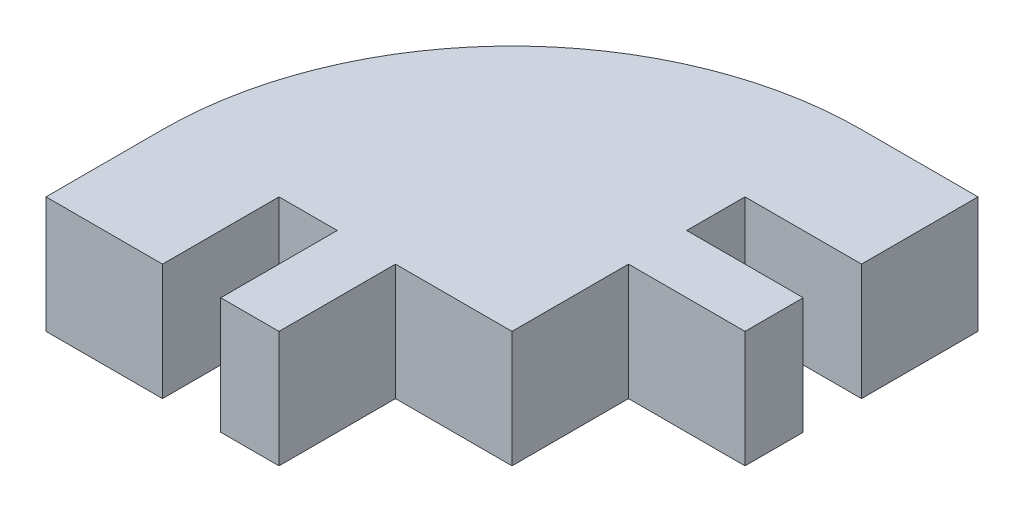
ISO-10303-21;
HEADER;
FILE_DESCRIPTION(('STEP AP214'),'2;1');
FILE_NAME('part.step','',(''),(''),'','','');
FILE_SCHEMA(('AUTOMOTIVE_DESIGN { 1 0 10303 214 1 1 1 1 }'));
ENDSEC;
DATA;
#1=APPLICATION_CONTEXT('core data for automotive mechanical design processes');
#2=APPLICATION_PROTOCOL_DEFINITION('international standard','automotive_design',2000,#1);
#3=PRODUCT_CONTEXT('',#1,'mechanical');
#4=PRODUCT('Part','Part','',(#3));
#5=PRODUCT_RELATED_PRODUCT_CATEGORY('part','',(#4));
#6=PRODUCT_DEFINITION_FORMATION('','',#4);
#7=PRODUCT_DEFINITION_CONTEXT('part definition',#1,'design');
#8=PRODUCT_DEFINITION('design','',#6,#7);
#9=PRODUCT_DEFINITION_SHAPE('','',#8);
#10=(LENGTH_UNIT() NAMED_UNIT(*) SI_UNIT(.MILLI.,.METRE.));
#11=(NAMED_UNIT(*) PLANE_ANGLE_UNIT() SI_UNIT($,.RADIAN.));
#12=(NAMED_UNIT(*) SI_UNIT($,.STERADIAN.) SOLID_ANGLE_UNIT());
#13=UNCERTAINTY_MEASURE_WITH_UNIT(LENGTH_MEASURE(1.E-05),#10,'distance_accuracy_value','');
#14=(GEOMETRIC_REPRESENTATION_CONTEXT(3) GLOBAL_UNCERTAINTY_ASSIGNED_CONTEXT((#13)) GLOBAL_UNIT_ASSIGNED_CONTEXT((#10,
#11,#12)) REPRESENTATION_CONTEXT('',''));
#15=CARTESIAN_POINT('',(0.,0.,0.));
#16=DIRECTION('',(0.,0.,1.));
#17=DIRECTION('',(1.,0.,0.));
#18=AXIS2_PLACEMENT_3D('',#15,#16,#17);
#19=CARTESIAN_POINT('',(-125.,0.,9.));
#20=DIRECTION('',(0.,0.,1.));
#21=DIRECTION('',(1.,0.,0.));
#22=AXIS2_PLACEMENT_3D('',#19,#20,#21);
#23=PLANE('',#22);
#24=DIRECTION('',(1.,0.,0.));
#25=VECTOR('',#24,1.);
#26=CARTESIAN_POINT('',(0.,-20.5,9.));
#27=LINE('',#26,#25);
#28=CARTESIAN_POINT('',(-6.49999999999998,-20.5,9.));
#29=VERTEX_POINT('',#28);
#30=CARTESIAN_POINT('',(2.50000000000001,-20.5,9.));
#31=VERTEX_POINT('',#30);
#32=EDGE_CURVE('E276',#29,#31,#27,.T.);
#33=ORIENTED_EDGE('',*,*,#32,.F.);
#34=DIRECTION('',(0.,-1.,0.));
#35=VECTOR('',#34,1.);
#36=CARTESIAN_POINT('',(-6.49999999999998,25.,9.));
#37=LINE('',#36,#35);
#38=CARTESIAN_POINT('',(-6.49999999999998,-29.5,9.));
#39=VERTEX_POINT('',#38);
#40=EDGE_CURVE('E217',#29,#39,#37,.T.);
#41=ORIENTED_EDGE('',*,*,#40,.T.);
#42=DIRECTION('',(1.,0.,0.));
#43=VECTOR('',#42,1.);
#44=CARTESIAN_POINT('',(0.,-29.5,9.));
#45=LINE('',#44,#43);
#46=CARTESIAN_POINT('',(2.50000000000001,-29.5,9.));
#47=VERTEX_POINT('',#46);
#48=EDGE_CURVE('E200',#39,#47,#45,.T.);
#49=ORIENTED_EDGE('',*,*,#48,.T.);
#50=DIRECTION('',(0.,-1.,0.));
#51=VECTOR('',#50,1.);
#52=CARTESIAN_POINT('',(2.50000000000001,25.,9.));
#53=LINE('',#52,#51);
#54=EDGE_CURVE('E215',#31,#47,#53,.T.);
#55=ORIENTED_EDGE('',*,*,#54,.F.);
#56=EDGE_LOOP('',(#33,#41,#49,#55));
#57=FACE_BOUND('',#56,.T.);
#58=ADVANCED_FACE('F82',(#57),#23,.T.);
#59=CARTESIAN_POINT('',(7.00000000000001,-20.5,9.));
#60=VERTEX_POINT('',#59);
#61=CARTESIAN_POINT('',(11.5,-20.5,9.));
#62=VERTEX_POINT('',#61);
#63=EDGE_CURVE('E274',#60,#62,#27,.T.);
#64=ORIENTED_EDGE('',*,*,#63,.F.);
#65=DIRECTION('',(0.,-1.,0.));
#66=VECTOR('',#65,1.);
#67=CARTESIAN_POINT('',(7.00000000000001,25.,9.));
#68=LINE('',#67,#66);
#69=CARTESIAN_POINT('',(7.00000000000001,-29.5,9.));
#70=VERTEX_POINT('',#69);
#71=EDGE_CURVE('E224',#60,#70,#68,.T.);
#72=ORIENTED_EDGE('',*,*,#71,.T.);
#73=CARTESIAN_POINT('',(11.5,-29.5,9.));
#74=VERTEX_POINT('',#73);
#75=EDGE_CURVE('E218',#70,#74,#45,.T.);
#76=ORIENTED_EDGE('',*,*,#75,.T.);
#77=DIRECTION('',(0.,-1.,0.));
#78=VECTOR('',#77,1.);
#79=CARTESIAN_POINT('',(11.5,25.,9.));
#80=LINE('',#79,#78);
#81=EDGE_CURVE('E325',#62,#74,#80,.T.);
#82=ORIENTED_EDGE('',*,*,#81,.F.);
#83=EDGE_LOOP('',(#64,#72,#76,#82));
#84=FACE_BOUND('',#83,.T.);
#85=ADVANCED_FACE('F388',(#84),#23,.T.);
#86=CARTESIAN_POINT('',(29.5,0.,9.));
#87=DIRECTION('',(1.,0.,0.));
#88=DIRECTION('',(0.,0.,-1.));
#89=AXIS2_PLACEMENT_3D('',#86,#87,#88);
#90=PLANE('',#89);
#91=DIRECTION('',(0.,0.,-1.));
#92=VECTOR('',#91,1.);
#93=CARTESIAN_POINT('',(29.5,-20.5,9.));
#94=LINE('',#93,#92);
#95=CARTESIAN_POINT('',(29.5,-20.5,-9.));
#96=VERTEX_POINT('',#95);
#97=CARTESIAN_POINT('',(29.5,-20.5,-13.5));
#98=VERTEX_POINT('',#97);
#99=EDGE_CURVE('E298',#96,#98,#94,.T.);
#100=ORIENTED_EDGE('',*,*,#99,.F.);
#101=DIRECTION('',(0.,-1.,0.));
#102=VECTOR('',#101,1.);
#103=CARTESIAN_POINT('',(29.5,25.,-9.));
#104=LINE('',#103,#102);
#105=CARTESIAN_POINT('',(29.5,-29.5,-9.));
#106=VERTEX_POINT('',#105);
#107=EDGE_CURVE('E308',#96,#106,#104,.T.);
#108=ORIENTED_EDGE('',*,*,#107,.T.);
#109=DIRECTION('',(0.,0.,-1.));
#110=VECTOR('',#109,1.);
#111=CARTESIAN_POINT('',(29.5,-29.5,9.));
#112=LINE('',#111,#110);
#113=CARTESIAN_POINT('',(29.5,-29.5,-13.5));
#114=VERTEX_POINT('',#113);
#115=EDGE_CURVE('E96',#106,#114,#112,.T.);
#116=ORIENTED_EDGE('',*,*,#115,.T.);
#117=DIRECTION('',(0.,-1.,0.));
#118=VECTOR('',#117,1.);
#119=CARTESIAN_POINT('',(29.5,25.,-13.5));
#120=LINE('',#119,#118);
#121=EDGE_CURVE('E311',#98,#114,#120,.T.);
#122=ORIENTED_EDGE('',*,*,#121,.F.);
#123=EDGE_LOOP('',(#100,#108,#116,#122));
#124=FACE_BOUND('',#123,.T.);
#125=ADVANCED_FACE('F369',(#124),#90,.T.);
#126=CARTESIAN_POINT('',(0.,0.,-27.));
#127=DIRECTION('',(0.,0.,-1.));
#128=DIRECTION('',(-1.,0.,0.));
#129=AXIS2_PLACEMENT_3D('',#126,#127,#128);
#130=PLANE('',#129);
#131=DIRECTION('',(1.,0.,0.));
#132=VECTOR('',#131,1.);
#133=CARTESIAN_POINT('',(0.,-20.5,-27.));
#134=LINE('',#133,#132);
#135=CARTESIAN_POINT('',(20.5,-20.5,-27.));
#136=VERTEX_POINT('',#135);
#137=CARTESIAN_POINT('',(29.5,-20.5,-27.));
#138=VERTEX_POINT('',#137);
#139=EDGE_CURVE('E209',#136,#138,#134,.T.);
#140=ORIENTED_EDGE('',*,*,#139,.T.);
#141=DIRECTION('',(0.,-1.,0.));
#142=VECTOR('',#141,1.);
#143=CARTESIAN_POINT('',(29.5,25.,-27.));
#144=LINE('',#143,#142);
#145=CARTESIAN_POINT('',(29.5,-29.5,-27.));
#146=VERTEX_POINT('',#145);
#147=EDGE_CURVE('E273',#138,#146,#144,.T.);
#148=ORIENTED_EDGE('',*,*,#147,.T.);
#149=DIRECTION('',(1.,0.,0.));
#150=VECTOR('',#149,1.);
#151=CARTESIAN_POINT('',(0.,-29.5,-27.));
#152=LINE('',#151,#150);
#153=CARTESIAN_POINT('',(20.5,-29.5,-27.));
#154=VERTEX_POINT('',#153);
#155=EDGE_CURVE('E103',#154,#146,#152,.T.);
#156=ORIENTED_EDGE('',*,*,#155,.F.);
#157=DIRECTION('',(0.,1.,0.));
#158=VECTOR('',#157,1.);
#159=CARTESIAN_POINT('',(20.5,-29.5,-27.));
#160=LINE('',#159,#158);
#161=EDGE_CURVE('E256',#154,#136,#160,.T.);
#162=ORIENTED_EDGE('',*,*,#161,.T.);
#163=EDGE_LOOP('',(#140,#148,#156,#162));
#164=FACE_BOUND('',#163,.T.);
#165=ADVANCED_FACE('F270',(#164),#130,.T.);
#166=CARTESIAN_POINT('',(0.,0.,-18.));
#167=DIRECTION('',(0.,0.,-1.));
#168=DIRECTION('',(-1.,0.,0.));
#169=AXIS2_PLACEMENT_3D('',#166,#167,#168);
#170=PLANE('',#169);
#171=DIRECTION('',(0.,-1.,0.));
#172=VECTOR('',#171,1.);
#173=CARTESIAN_POINT('',(29.5,25.,-18.));
#174=LINE('',#173,#172);
#175=CARTESIAN_POINT('',(29.5,-20.5,-18.));
#176=VERTEX_POINT('',#175);
#177=CARTESIAN_POINT('',(29.5,-29.5,-18.));
#178=VERTEX_POINT('',#177);
#179=EDGE_CURVE('E320',#176,#178,#174,.T.);
#180=ORIENTED_EDGE('',*,*,#179,.F.);
#181=DIRECTION('',(-1.,0.,0.));
#182=VECTOR('',#181,1.);
#183=CARTESIAN_POINT('',(0.,-20.5,-18.));
#184=LINE('',#183,#182);
#185=CARTESIAN_POINT('',(20.5,-20.5,-18.));
#186=VERTEX_POINT('',#185);
#187=EDGE_CURVE('E304',#176,#186,#184,.T.);
#188=ORIENTED_EDGE('',*,*,#187,.T.);
#189=DIRECTION('',(0.,-1.,0.));
#190=VECTOR('',#189,1.);
#191=CARTESIAN_POINT('',(20.5,25.,-18.));
#192=LINE('',#191,#190);
#193=CARTESIAN_POINT('',(20.5,-29.5,-18.));
#194=VERTEX_POINT('',#193);
#195=EDGE_CURVE('E317',#186,#194,#192,.T.);
#196=ORIENTED_EDGE('',*,*,#195,.T.);
#197=DIRECTION('',(-1.,0.,0.));
#198=VECTOR('',#197,1.);
#199=CARTESIAN_POINT('',(0.,-29.5,-18.));
#200=LINE('',#199,#198);
#201=EDGE_CURVE('E288',#178,#194,#200,.T.);
#202=ORIENTED_EDGE('',*,*,#201,.F.);
#203=EDGE_LOOP('',(#180,#188,#196,#202));
#204=FACE_BOUND('',#203,.T.);
#205=ADVANCED_FACE('F357',(#204),#170,.F.);
#206=CARTESIAN_POINT('',(2.50000000000001,25.,0.));
#207=DIRECTION('',(1.,0.,0.));
#208=DIRECTION('',(0.,0.,-1.));
#209=AXIS2_PLACEMENT_3D('',#206,#207,#208);
#210=PLANE('',#209);
#211=DIRECTION('',(0.,0.,-1.));
#212=VECTOR('',#211,1.);
#213=CARTESIAN_POINT('',(2.50000000000001,-20.5,0.));
#214=LINE('',#213,#212);
#215=CARTESIAN_POINT('',(2.5,-20.5,0.));
#216=VERTEX_POINT('',#215);
#217=EDGE_CURVE('E222',#31,#216,#214,.T.);
#218=ORIENTED_EDGE('',*,*,#217,.F.);
#219=ORIENTED_EDGE('',*,*,#54,.T.);
#220=DIRECTION('',(0.,0.,-1.));
#221=VECTOR('',#220,1.);
#222=CARTESIAN_POINT('',(2.50000000000001,-29.5,0.));
#223=LINE('',#222,#221);
#224=CARTESIAN_POINT('',(2.5,-29.5,0.));
#225=VERTEX_POINT('',#224);
#226=EDGE_CURVE('E196',#47,#225,#223,.T.);
#227=ORIENTED_EDGE('',*,*,#226,.T.);
#228=DIRECTION('',(0.,-1.,0.));
#229=VECTOR('',#228,1.);
#230=CARTESIAN_POINT('',(2.50000000000001,25.,0.));
#231=LINE('',#230,#229);
#232=EDGE_CURVE('E337',#216,#225,#231,.T.);
#233=ORIENTED_EDGE('',*,*,#232,.F.);
#234=EDGE_LOOP('',(#218,#219,#227,#233));
#235=FACE_BOUND('',#234,.T.);
#236=ADVANCED_FACE('F221',(#235),#210,.T.);
#237=CARTESIAN_POINT('',(7.00000000000001,25.,0.));
#238=DIRECTION('',(-1.,0.,0.));
#239=DIRECTION('',(0.,0.,1.));
#240=AXIS2_PLACEMENT_3D('',#237,#238,#239);
#241=PLANE('',#240);
#242=DIRECTION('',(0.,0.,1.));
#243=VECTOR('',#242,1.);
#244=CARTESIAN_POINT('',(7.00000000000001,-20.5,0.));
#245=LINE('',#244,#243);
#246=CARTESIAN_POINT('',(7.00000000000001,-20.5,0.));
#247=VERTEX_POINT('',#246);
#248=EDGE_CURVE('E306',#247,#60,#245,.T.);
#249=ORIENTED_EDGE('',*,*,#248,.F.);
#250=DIRECTION('',(0.,-1.,0.));
#251=VECTOR('',#250,1.);
#252=CARTESIAN_POINT('',(7.00000000000001,25.,0.));
#253=LINE('',#252,#251);
#254=CARTESIAN_POINT('',(7.00000000000001,-29.5,0.));
#255=VERTEX_POINT('',#254);
#256=EDGE_CURVE('E229',#247,#255,#253,.T.);
#257=ORIENTED_EDGE('',*,*,#256,.T.);
#258=DIRECTION('',(0.,0.,1.));
#259=VECTOR('',#258,1.);
#260=CARTESIAN_POINT('',(7.00000000000001,-29.5,0.));
#261=LINE('',#260,#259);
#262=EDGE_CURVE('E290',#255,#70,#261,.T.);
#263=ORIENTED_EDGE('',*,*,#262,.T.);
#264=ORIENTED_EDGE('',*,*,#71,.F.);
#265=EDGE_LOOP('',(#249,#257,#263,#264));
#266=FACE_BOUND('',#265,.T.);
#267=ADVANCED_FACE('F341',(#266),#241,.T.);
#268=CARTESIAN_POINT('',(0.,25.,-13.5));
#269=DIRECTION('',(0.,0.,-1.));
#270=DIRECTION('',(-1.,0.,0.));
#271=AXIS2_PLACEMENT_3D('',#268,#269,#270);
#272=PLANE('',#271);
#273=DIRECTION('',(-1.,0.,0.));
#274=VECTOR('',#273,1.);
#275=CARTESIAN_POINT('',(0.,-20.5,-13.5));
#276=LINE('',#275,#274);
#277=CARTESIAN_POINT('',(20.5,-20.5,-13.5));
#278=VERTEX_POINT('',#277);
#279=EDGE_CURVE('E296',#98,#278,#276,.T.);
#280=ORIENTED_EDGE('',*,*,#279,.F.);
#281=ORIENTED_EDGE('',*,*,#121,.T.);
#282=DIRECTION('',(-1.,0.,0.));
#283=VECTOR('',#282,1.);
#284=CARTESIAN_POINT('',(0.,-29.5,-13.5));
#285=LINE('',#284,#283);
#286=CARTESIAN_POINT('',(20.5,-29.5,-13.5000000000218));
#287=VERTEX_POINT('',#286);
#288=EDGE_CURVE('E281',#114,#287,#285,.T.);
#289=ORIENTED_EDGE('',*,*,#288,.T.);
#290=DIRECTION('',(0.,-1.,0.));
#291=VECTOR('',#290,1.);
#292=CARTESIAN_POINT('',(20.5,25.,-13.5));
#293=LINE('',#292,#291);
#294=EDGE_CURVE('E314',#278,#287,#293,.T.);
#295=ORIENTED_EDGE('',*,*,#294,.F.);
#296=EDGE_LOOP('',(#280,#281,#289,#295));
#297=FACE_BOUND('',#296,.T.);
#298=ADVANCED_FACE('F365',(#297),#272,.T.);
#299=CARTESIAN_POINT('',(0.,25.,-9.));
#300=DIRECTION('',(0.,0.,1.));
#301=DIRECTION('',(1.,0.,0.));
#302=AXIS2_PLACEMENT_3D('',#299,#300,#301);
#303=PLANE('',#302);
#304=DIRECTION('',(1.,0.,0.));
#305=VECTOR('',#304,1.);
#306=CARTESIAN_POINT('',(0.,-20.5,-9.));
#307=LINE('',#306,#305);
#308=CARTESIAN_POINT('',(20.5,-20.5,-9.));
#309=VERTEX_POINT('',#308);
#310=EDGE_CURVE('E300',#309,#96,#307,.T.);
#311=ORIENTED_EDGE('',*,*,#310,.F.);
#312=DIRECTION('',(0.,-1.,0.));
#313=VECTOR('',#312,1.);
#314=CARTESIAN_POINT('',(20.5,25.,-9.));
#315=LINE('',#314,#313);
#316=CARTESIAN_POINT('',(20.5,-29.5,-9.));
#317=VERTEX_POINT('',#316);
#318=EDGE_CURVE('E334',#309,#317,#315,.T.);
#319=ORIENTED_EDGE('',*,*,#318,.T.);
#320=DIRECTION('',(1.,0.,0.));
#321=VECTOR('',#320,1.);
#322=CARTESIAN_POINT('',(0.,-29.5,-9.));
#323=LINE('',#322,#321);
#324=EDGE_CURVE('E284',#317,#106,#323,.T.);
#325=ORIENTED_EDGE('',*,*,#324,.T.);
#326=ORIENTED_EDGE('',*,*,#107,.F.);
#327=EDGE_LOOP('',(#311,#319,#325,#326));
#328=FACE_BOUND('',#327,.T.);
#329=ADVANCED_FACE('F372',(#328),#303,.T.);
#330=CARTESIAN_POINT('',(29.5,25.,0.));
#331=DIRECTION('',(1.,0.,0.));
#332=DIRECTION('',(0.,0.,-1.));
#333=AXIS2_PLACEMENT_3D('',#330,#331,#332);
#334=PLANE('',#333);
#335=DIRECTION('',(0.,0.,-1.));
#336=VECTOR('',#335,1.);
#337=CARTESIAN_POINT('',(29.5,-20.5,0.));
#338=LINE('',#337,#336);
#339=EDGE_CURVE('E302',#176,#138,#338,.T.);
#340=ORIENTED_EDGE('',*,*,#339,.F.);
#341=ORIENTED_EDGE('',*,*,#179,.T.);
#342=DIRECTION('',(0.,0.,-1.));
#343=VECTOR('',#342,1.);
#344=CARTESIAN_POINT('',(29.5,-29.5,0.));
#345=LINE('',#344,#343);
#346=EDGE_CURVE('E286',#178,#146,#345,.T.);
#347=ORIENTED_EDGE('',*,*,#346,.T.);
#348=ORIENTED_EDGE('',*,*,#147,.F.);
#349=EDGE_LOOP('',(#340,#341,#347,#348));
#350=FACE_BOUND('',#349,.T.);
#351=ADVANCED_FACE('F354',(#350),#334,.T.);
#352=CARTESIAN_POINT('',(11.5,25.,0.));
#353=DIRECTION('',(1.,0.,0.));
#354=DIRECTION('',(0.,0.,-1.));
#355=AXIS2_PLACEMENT_3D('',#352,#353,#354);
#356=PLANE('',#355);
#357=DIRECTION('',(0.,0.,-1.));
#358=VECTOR('',#357,1.);
#359=CARTESIAN_POINT('',(11.5,-20.5,0.));
#360=LINE('',#359,#358);
#361=CARTESIAN_POINT('',(11.5,-20.5,0.));
#362=VERTEX_POINT('',#361);
#363=EDGE_CURVE('E294',#62,#362,#360,.T.);
#364=ORIENTED_EDGE('',*,*,#363,.F.);
#365=ORIENTED_EDGE('',*,*,#81,.T.);
#366=DIRECTION('',(0.,0.,-1.));
#367=VECTOR('',#366,1.);
#368=CARTESIAN_POINT('',(11.5,-29.5,0.));
#369=LINE('',#368,#367);
#370=CARTESIAN_POINT('',(11.5,-29.5,0.));
#371=VERTEX_POINT('',#370);
#372=EDGE_CURVE('E208',#74,#371,#369,.T.);
#373=ORIENTED_EDGE('',*,*,#372,.T.);
#374=DIRECTION('',(0.,-1.,0.));
#375=VECTOR('',#374,1.);
#376=CARTESIAN_POINT('',(11.5,25.,0.));
#377=LINE('',#376,#375);
#378=EDGE_CURVE('E328',#362,#371,#377,.T.);
#379=ORIENTED_EDGE('',*,*,#378,.F.);
#380=EDGE_LOOP('',(#364,#365,#373,#379));
#381=FACE_BOUND('',#380,.T.);
#382=ADVANCED_FACE('F385',(#381),#356,.T.);
#383=CARTESIAN_POINT('',(-6.49999999999998,25.,0.));
#384=DIRECTION('',(-1.,0.,0.));
#385=DIRECTION('',(0.,0.,1.));
#386=AXIS2_PLACEMENT_3D('',#383,#384,#385);
#387=PLANE('',#386);
#388=DIRECTION('',(0.,0.,1.));
#389=VECTOR('',#388,1.);
#390=CARTESIAN_POINT('',(-6.49999999999998,-20.5,0.));
#391=LINE('',#390,#389);
#392=CARTESIAN_POINT('',(-6.49999999999998,-20.5,0.));
#393=VERTEX_POINT('',#392);
#394=EDGE_CURVE('E12',#393,#29,#391,.T.);
#395=ORIENTED_EDGE('',*,*,#394,.F.);
#396=DIRECTION('',(0.,1.,0.));
#397=VECTOR('',#396,1.);
#398=CARTESIAN_POINT('',(-6.49999999999998,-29.5,0.));
#399=LINE('',#398,#397);
#400=CARTESIAN_POINT('',(-6.49999999999998,-29.5,0.));
#401=VERTEX_POINT('',#400);
#402=EDGE_CURVE('E257',#401,#393,#399,.T.);
#403=ORIENTED_EDGE('',*,*,#402,.F.);
#404=DIRECTION('',(0.,0.,1.));
#405=VECTOR('',#404,1.);
#406=CARTESIAN_POINT('',(-6.49999999999998,-29.5,0.));
#407=LINE('',#406,#405);
#408=EDGE_CURVE('E89',#401,#39,#407,.T.);
#409=ORIENTED_EDGE('',*,*,#408,.T.);
#410=ORIENTED_EDGE('',*,*,#40,.F.);
#411=EDGE_LOOP('',(#395,#403,#409,#410));
#412=FACE_BOUND('',#411,.T.);
#413=ADVANCED_FACE('F263',(#412),#387,.T.);
#414=CARTESIAN_POINT('',(0.,-29.5,0.));
#415=DIRECTION('',(0.,1.,0.));
#416=DIRECTION('',(0.,0.,1.));
#417=AXIS2_PLACEMENT_3D('',#414,#415,#416);
#418=PLANE('',#417);
#419=DIRECTION('',(-1.,0.,0.));
#420=VECTOR('',#419,1.);
#421=CARTESIAN_POINT('',(0.,-29.5,0.));
#422=LINE('',#421,#420);
#423=CARTESIAN_POINT('',(20.5,-29.5,0.));
#424=VERTEX_POINT('',#423);
#425=EDGE_CURVE('E251',#424,#371,#422,.T.);
#426=ORIENTED_EDGE('',*,*,#425,.T.);
#427=ORIENTED_EDGE('',*,*,#372,.F.);
#428=ORIENTED_EDGE('',*,*,#75,.F.);
#429=ORIENTED_EDGE('',*,*,#262,.F.);
#430=DIRECTION('',(-1.,0.,0.));
#431=VECTOR('',#430,1.);
#432=CARTESIAN_POINT('',(0.,-29.5,0.));
#433=LINE('',#432,#431);
#434=EDGE_CURVE('E203',#255,#225,#433,.T.);
#435=ORIENTED_EDGE('',*,*,#434,.T.);
#436=ORIENTED_EDGE('',*,*,#226,.F.);
#437=ORIENTED_EDGE('',*,*,#48,.F.);
#438=ORIENTED_EDGE('',*,*,#408,.F.);
#439=CARTESIAN_POINT('',(20.5,-29.5,0.));
#440=DIRECTION('',(0.,1.,0.));
#441=DIRECTION('',(0.,0.,1.));
#442=AXIS2_PLACEMENT_3D('',#439,#440,#441);
#443=CIRCLE('',#442,27.);
#444=EDGE_CURVE('E253',#154,#401,#443,.T.);
#445=ORIENTED_EDGE('',*,*,#444,.F.);
#446=ORIENTED_EDGE('',*,*,#155,.T.);
#447=ORIENTED_EDGE('',*,*,#346,.F.);
#448=ORIENTED_EDGE('',*,*,#201,.T.);
#449=DIRECTION('',(0.,0.,1.));
#450=VECTOR('',#449,1.);
#451=CARTESIAN_POINT('',(20.5,-29.5,0.));
#452=LINE('',#451,#450);
#453=EDGE_CURVE('E237',#194,#287,#452,.T.);
#454=ORIENTED_EDGE('',*,*,#453,.T.);
#455=ORIENTED_EDGE('',*,*,#288,.F.);
#456=ORIENTED_EDGE('',*,*,#115,.F.);
#457=ORIENTED_EDGE('',*,*,#324,.F.);
#458=DIRECTION('',(0.,0.,1.));
#459=VECTOR('',#458,1.);
#460=CARTESIAN_POINT('',(20.5,-29.5,0.));
#461=LINE('',#460,#459);
#462=EDGE_CURVE('E242',#317,#424,#461,.T.);
#463=ORIENTED_EDGE('',*,*,#462,.T.);
#464=EDGE_LOOP('',(#426,#427,#428,#429,#435,#436,#437,#438,#445,#446,#447,#448,#454,#455,#456,
#457,#463));
#465=FACE_BOUND('',#464,.T.);
#466=ADVANCED_FACE('F199',(#465),#418,.F.);
#467=CARTESIAN_POINT('',(0.,-20.5,0.));
#468=DIRECTION('',(0.,1.,0.));
#469=DIRECTION('',(0.,0.,1.));
#470=AXIS2_PLACEMENT_3D('',#467,#468,#469);
#471=PLANE('',#470);
#472=DIRECTION('',(-1.,0.,0.));
#473=VECTOR('',#472,1.);
#474=CARTESIAN_POINT('',(0.,-20.5,0.));
#475=LINE('',#474,#473);
#476=CARTESIAN_POINT('',(20.5,-20.5,0.));
#477=VERTEX_POINT('',#476);
#478=EDGE_CURVE('E245',#477,#362,#475,.T.);
#479=ORIENTED_EDGE('',*,*,#478,.F.);
#480=DIRECTION('',(0.,0.,1.));
#481=VECTOR('',#480,1.);
#482=CARTESIAN_POINT('',(20.5,-20.5,0.));
#483=LINE('',#482,#481);
#484=EDGE_CURVE('E240',#309,#477,#483,.T.);
#485=ORIENTED_EDGE('',*,*,#484,.F.);
#486=ORIENTED_EDGE('',*,*,#310,.T.);
#487=ORIENTED_EDGE('',*,*,#99,.T.);
#488=ORIENTED_EDGE('',*,*,#279,.T.);
#489=DIRECTION('',(0.,0.,1.));
#490=VECTOR('',#489,1.);
#491=CARTESIAN_POINT('',(20.5,-20.5,0.));
#492=LINE('',#491,#490);
#493=EDGE_CURVE('E234',#186,#278,#492,.T.);
#494=ORIENTED_EDGE('',*,*,#493,.F.);
#495=ORIENTED_EDGE('',*,*,#187,.F.);
#496=ORIENTED_EDGE('',*,*,#339,.T.);
#497=ORIENTED_EDGE('',*,*,#139,.F.);
#498=CARTESIAN_POINT('',(20.5,-20.5,0.));
#499=DIRECTION('',(0.,1.,0.));
#500=DIRECTION('',(0.,0.,1.));
#501=AXIS2_PLACEMENT_3D('',#498,#499,#500);
#502=CIRCLE('',#501,27.);
#503=EDGE_CURVE('E248',#136,#393,#502,.T.);
#504=ORIENTED_EDGE('',*,*,#503,.T.);
#505=ORIENTED_EDGE('',*,*,#394,.T.);
#506=ORIENTED_EDGE('',*,*,#32,.T.);
#507=ORIENTED_EDGE('',*,*,#217,.T.);
#508=DIRECTION('',(-1.,0.,0.));
#509=VECTOR('',#508,1.);
#510=CARTESIAN_POINT('',(0.,-20.5,0.));
#511=LINE('',#510,#509);
#512=EDGE_CURVE('E223',#247,#216,#511,.T.);
#513=ORIENTED_EDGE('',*,*,#512,.F.);
#514=ORIENTED_EDGE('',*,*,#248,.T.);
#515=ORIENTED_EDGE('',*,*,#63,.T.);
#516=ORIENTED_EDGE('',*,*,#363,.T.);
#517=EDGE_LOOP('',(#479,#485,#486,#487,#488,#494,#495,#496,#497,#504,#505,#506,#507,#513,#514,
#515,#516));
#518=FACE_BOUND('',#517,.T.);
#519=ADVANCED_FACE('F348',(#518),#471,.T.);
#520=CARTESIAN_POINT('',(20.5,-29.5,0.));
#521=DIRECTION('',(0.,1.,0.));
#522=DIRECTION('',(0.,0.,1.));
#523=AXIS2_PLACEMENT_3D('',#520,#521,#522);
#524=CYLINDRICAL_SURFACE('',#523,27.);
#525=ORIENTED_EDGE('',*,*,#402,.T.);
#526=ORIENTED_EDGE('',*,*,#503,.F.);
#527=ORIENTED_EDGE('',*,*,#161,.F.);
#528=ORIENTED_EDGE('',*,*,#444,.T.);
#529=EDGE_LOOP('',(#525,#526,#527,#528));
#530=FACE_BOUND('',#529,.T.);
#531=ADVANCED_FACE('F266',(#530),#524,.T.);
#532=CARTESIAN_POINT('',(0.,25.,0.));
#533=DIRECTION('',(0.,0.,-1.));
#534=DIRECTION('',(-1.,0.,0.));
#535=AXIS2_PLACEMENT_3D('',#532,#533,#534);
#536=PLANE('',#535);
#537=ORIENTED_EDGE('',*,*,#256,.F.);
#538=ORIENTED_EDGE('',*,*,#512,.T.);
#539=ORIENTED_EDGE('',*,*,#232,.T.);
#540=ORIENTED_EDGE('',*,*,#434,.F.);
#541=EDGE_LOOP('',(#537,#538,#539,#540));
#542=FACE_BOUND('',#541,.T.);
#543=ADVANCED_FACE('F345',(#542),#536,.F.);
#544=CARTESIAN_POINT('',(0.,25.,0.));
#545=DIRECTION('',(0.,0.,-1.));
#546=DIRECTION('',(-1.,0.,0.));
#547=AXIS2_PLACEMENT_3D('',#544,#545,#546);
#548=PLANE('',#547);
#549=DIRECTION('',(0.,-1.,0.));
#550=VECTOR('',#549,1.);
#551=CARTESIAN_POINT('',(20.5,25.,0.));
#552=LINE('',#551,#550);
#553=EDGE_CURVE('E331',#477,#424,#552,.T.);
#554=ORIENTED_EDGE('',*,*,#553,.F.);
#555=ORIENTED_EDGE('',*,*,#478,.T.);
#556=ORIENTED_EDGE('',*,*,#378,.T.);
#557=ORIENTED_EDGE('',*,*,#425,.F.);
#558=EDGE_LOOP('',(#554,#555,#556,#557));
#559=FACE_BOUND('',#558,.T.);
#560=ADVANCED_FACE('F380',(#559),#548,.F.);
#561=CARTESIAN_POINT('',(20.5,25.,0.));
#562=DIRECTION('',(-1.,0.,0.));
#563=DIRECTION('',(0.,0.,1.));
#564=AXIS2_PLACEMENT_3D('',#561,#562,#563);
#565=PLANE('',#564);
#566=ORIENTED_EDGE('',*,*,#318,.F.);
#567=ORIENTED_EDGE('',*,*,#484,.T.);
#568=ORIENTED_EDGE('',*,*,#553,.T.);
#569=ORIENTED_EDGE('',*,*,#462,.F.);
#570=EDGE_LOOP('',(#566,#567,#568,#569));
#571=FACE_BOUND('',#570,.T.);
#572=ADVANCED_FACE('F376',(#571),#565,.F.);
#573=CARTESIAN_POINT('',(20.5,25.,0.));
#574=DIRECTION('',(-1.,0.,0.));
#575=DIRECTION('',(0.,0.,1.));
#576=AXIS2_PLACEMENT_3D('',#573,#574,#575);
#577=PLANE('',#576);
#578=ORIENTED_EDGE('',*,*,#195,.F.);
#579=ORIENTED_EDGE('',*,*,#493,.T.);
#580=ORIENTED_EDGE('',*,*,#294,.T.);
#581=ORIENTED_EDGE('',*,*,#453,.F.);
#582=EDGE_LOOP('',(#578,#579,#580,#581));
#583=FACE_BOUND('',#582,.T.);
#584=ADVANCED_FACE('F361',(#583),#577,.F.);
#585=CLOSED_SHELL('',(#58,#85,#125,#165,#205,#236,#267,#298,#329,#351,#382,#413,#466,#519,#531,
#543,#560,#572,#584));
#586=MANIFOLD_SOLID_BREP('B2',#585);
#587=ADVANCED_BREP_SHAPE_REPRESENTATION('',(#18,#586),#14);
#588=SHAPE_DEFINITION_REPRESENTATION(#9,#587);
ENDSEC;
END-ISO-10303-21;
